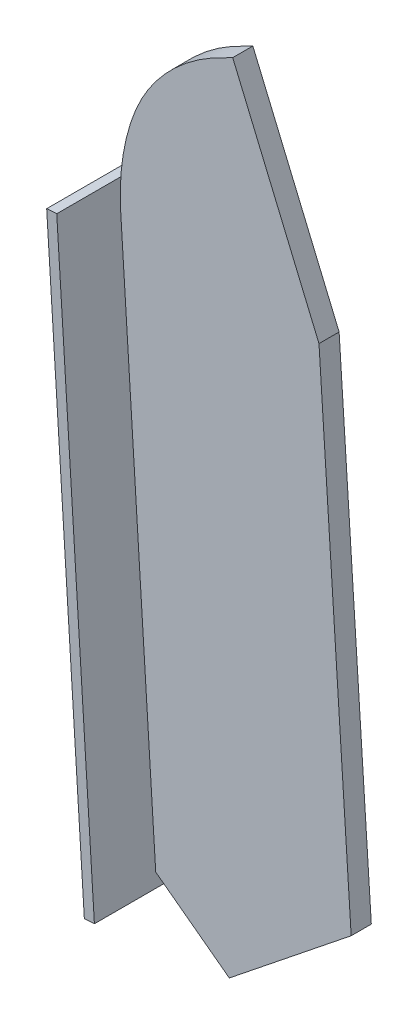
ISO-10303-21;
HEADER;
FILE_DESCRIPTION(('STEP AP214'),'2;1');
FILE_NAME('part.step','',(''),(''),'','','');
FILE_SCHEMA(('AUTOMOTIVE_DESIGN { 1 0 10303 214 1 1 1 1 }'));
ENDSEC;
DATA;
#1=APPLICATION_CONTEXT('core data for automotive mechanical design processes');
#2=APPLICATION_PROTOCOL_DEFINITION('international standard','automotive_design',2000,#1);
#3=PRODUCT_CONTEXT('',#1,'mechanical');
#4=PRODUCT('Part','Part','',(#3));
#5=PRODUCT_RELATED_PRODUCT_CATEGORY('part','',(#4));
#6=PRODUCT_DEFINITION_FORMATION('','',#4);
#7=PRODUCT_DEFINITION_CONTEXT('part definition',#1,'design');
#8=PRODUCT_DEFINITION('design','',#6,#7);
#9=PRODUCT_DEFINITION_SHAPE('','',#8);
#10=(LENGTH_UNIT() NAMED_UNIT(*) SI_UNIT(.MILLI.,.METRE.));
#11=(NAMED_UNIT(*) PLANE_ANGLE_UNIT() SI_UNIT($,.RADIAN.));
#12=(NAMED_UNIT(*) SI_UNIT($,.STERADIAN.) SOLID_ANGLE_UNIT());
#13=UNCERTAINTY_MEASURE_WITH_UNIT(LENGTH_MEASURE(1.E-05),#10,'distance_accuracy_value','');
#14=(GEOMETRIC_REPRESENTATION_CONTEXT(3) GLOBAL_UNCERTAINTY_ASSIGNED_CONTEXT((#13)) GLOBAL_UNIT_ASSIGNED_CONTEXT((#10,
#11,#12)) REPRESENTATION_CONTEXT('',''));
#15=CARTESIAN_POINT('',(0.,0.,0.));
#16=DIRECTION('',(0.,0.,1.));
#17=DIRECTION('',(1.,0.,0.));
#18=AXIS2_PLACEMENT_3D('',#15,#16,#17);
#19=CARTESIAN_POINT('',(-5.76768563353413,19.4994353421923,0.));
#20=DIRECTION('',(0.,0.,-1.));
#21=DIRECTION('',(-1.,0.,0.));
#22=AXIS2_PLACEMENT_3D('',#19,#20,#21);
#23=PLANE('',#22);
#24=DIRECTION('',(0.0630690403554269,-0.998009166365042,0.));
#25=VECTOR('',#24,1.);
#26=CARTESIAN_POINT('',(-7.28962168100287,19.4032568207607,0.));
#27=LINE('',#26,#25);
#28=CARTESIAN_POINT('',(-6.85277047189869,12.4904909285472,0.));
#29=VERTEX_POINT('',#28);
#30=CARTESIAN_POINT('',(-4.76666804704125,-20.5201483685025,0.));
#31=VERTEX_POINT('',#30);
#32=EDGE_CURVE('E234',#29,#31,#27,.T.);
#33=ORIENTED_EDGE('',*,*,#32,.F.);
#34=CARTESIAN_POINT('',(-0.181718188574369,23.7999261697487,0.));
#35=CARTESIAN_POINT('',(-0.70701341469865,23.5395380632294,0.));
#36=CARTESIAN_POINT('',(-1.23207783293486,23.2788070843344,0.));
#37=CARTESIAN_POINT('',(-2.23051080300372,22.6805492913545,0.));
#38=CARTESIAN_POINT('',(-2.70217201621648,22.3404861720603,0.));
#39=CARTESIAN_POINT('',(-3.59629517879887,21.5872728798945,0.));
#40=CARTESIAN_POINT('',(-4.02213355400517,21.1707525213189,0.));
#41=CARTESIAN_POINT('',(-4.78527457469842,20.2822620551444,0.));
#42=CARTESIAN_POINT('',(-5.12606160934101,19.8085724179294,0.));
#43=CARTESIAN_POINT('',(-5.56732173647134,19.0475575846983,0.));
#44=CARTESIAN_POINT('',(-5.70332933890473,18.7843151964143,0.));
#45=CARTESIAN_POINT('',(-5.95018246511931,18.2473971483734,0.));
#46=CARTESIAN_POINT('',(-6.0605755664184,17.9749523186406,0.));
#47=CARTESIAN_POINT('',(-6.35630443044148,17.1467766141278,0.));
#48=CARTESIAN_POINT('',(-6.50722921559899,16.5805224054116,0.));
#49=CARTESIAN_POINT('',(-6.73943545605117,15.4267161328061,0.));
#50=CARTESIAN_POINT('',(-6.81702667694273,14.8395680904238,0.));
#51=CARTESIAN_POINT('',(-6.87668510198232,13.6670249779812,0.));
#52=CARTESIAN_POINT('',(-6.86465760643239,13.0787546018732,0.));
#53=CARTESIAN_POINT('',(-6.85277047189869,12.4904909285471,0.));
#54=B_SPLINE_CURVE_WITH_KNOTS('',3,(#34,#35,#36,#37,#38,#39,#40,#41,#42,#43,#44,#45,#46,#47,#48,
#49,#50,#51,#52,#53),.UNSPECIFIED.,.F.,.F.,(4,2,2,2,2,2,2,2,2,4),(0.,0.125,0.25,
0.375000000000001,0.500000000000001,0.562500000000001,0.625000000000001,0.750000000000001,0.875,
1.),.UNSPECIFIED.);
#55=CARTESIAN_POINT('',(-0.181718188574369,23.7999261697487,0.));
#56=VERTEX_POINT('',#55);
#57=EDGE_CURVE('E116',#56,#29,#54,.T.);
#58=ORIENTED_EDGE('',*,*,#57,.F.);
#59=DIRECTION('',(-0.946291022800123,-0.323316099456704,0.));
#60=VECTOR('',#59,1.);
#61=CARTESIAN_POINT('',(-6.49950601762717,21.641348661489,0.));
#62=LINE('',#61,#60);
#63=CARTESIAN_POINT('',(-0.180003158251313,23.8005121384424,0.));
#64=VERTEX_POINT('',#63);
#65=EDGE_CURVE('E283',#64,#56,#62,.T.);
#66=ORIENTED_EDGE('',*,*,#65,.F.);
#67=DIRECTION('',(-0.388700505404293,0.92136416095833,0.));
#68=VECTOR('',#67,1.);
#69=CARTESIAN_POINT('',(0.51612952142517,22.1504198606907,0.));
#70=LINE('',#69,#68);
#71=CARTESIAN_POINT('',(4.96086831706904,11.6147427154608,0.));
#72=VERTEX_POINT('',#71);
#73=EDGE_CURVE('E280',#72,#64,#70,.T.);
#74=ORIENTED_EDGE('',*,*,#73,.F.);
#75=DIRECTION('',(-0.0646917913541603,0.997905292165238,0.));
#76=VECTOR('',#75,1.);
#77=CARTESIAN_POINT('',(4.4069625873647,20.1590332268574,0.));
#78=LINE('',#77,#76);
#79=CARTESIAN_POINT('',(6.87971706119031,-17.9845198268355,0.));
#80=VERTEX_POINT('',#79);
#81=EDGE_CURVE('E275',#80,#72,#78,.T.);
#82=ORIENTED_EDGE('',*,*,#81,.F.);
#83=DIRECTION('',(0.78086880944303,0.624695047554424,0.));
#84=VECTOR('',#83,1.);
#85=CARTESIAN_POINT('',(17.4527423297865,-9.52609961195851,0.));
#86=LINE('',#85,#84);
#87=CARTESIAN_POINT('',(-0.382255805973252,-23.7940981205663,0.));
#88=VERTEX_POINT('',#87);
#89=EDGE_CURVE('E273',#88,#80,#86,.T.);
#90=ORIENTED_EDGE('',*,*,#89,.F.);
#91=DIRECTION('',(0.801257856401329,-0.59831918534771,0.));
#92=VECTOR('',#91,1.);
#93=CARTESIAN_POINT('',(-24.595042006792,-5.71380798807742,0.));
#94=LINE('',#93,#92);
#95=EDGE_CURVE('E271',#31,#88,#94,.T.);
#96=ORIENTED_EDGE('',*,*,#95,.F.);
#97=EDGE_LOOP('',(#33,#58,#66,#74,#82,#90,#96));
#98=FACE_BOUND('',#97,.T.);
#99=ADVANCED_FACE('F92',(#98),#23,.T.);
#100=DIRECTION('',(0.,0.,1.));
#101=VECTOR('',#100,1.);
#102=SURFACE_OF_LINEAR_EXTRUSION('',#54,#101);
#103=CARTESIAN_POINT('',(-0.181718188574369,23.7999261697487,1.2));
#104=CARTESIAN_POINT('',(-0.70701341469865,23.5395380632294,1.2));
#105=CARTESIAN_POINT('',(-1.23207783293486,23.2788070843344,1.2));
#106=CARTESIAN_POINT('',(-2.23051080300372,22.6805492913545,1.2));
#107=CARTESIAN_POINT('',(-2.70217201621648,22.3404861720603,1.2));
#108=CARTESIAN_POINT('',(-3.59629517879887,21.5872728798945,1.2));
#109=CARTESIAN_POINT('',(-4.02213355400517,21.1707525213189,1.2));
#110=CARTESIAN_POINT('',(-4.78527457469842,20.2822620551444,1.2));
#111=CARTESIAN_POINT('',(-5.12606160934101,19.8085724179294,1.2));
#112=CARTESIAN_POINT('',(-5.56732173647134,19.0475575846983,1.2));
#113=CARTESIAN_POINT('',(-5.70332933890473,18.7843151964143,1.2));
#114=CARTESIAN_POINT('',(-5.95018246511931,18.2473971483734,1.2));
#115=CARTESIAN_POINT('',(-6.0605755664184,17.9749523186406,1.2));
#116=CARTESIAN_POINT('',(-6.35630443044148,17.1467766141278,1.2));
#117=CARTESIAN_POINT('',(-6.50722921559899,16.5805224054116,1.2));
#118=CARTESIAN_POINT('',(-6.73943545605117,15.4267161328061,1.2));
#119=CARTESIAN_POINT('',(-6.81702667694273,14.8395680904238,1.2));
#120=CARTESIAN_POINT('',(-6.87668510198232,13.6670249779812,1.2));
#121=CARTESIAN_POINT('',(-6.86465760643239,13.0787546018732,1.2));
#122=CARTESIAN_POINT('',(-6.85277047189869,12.4904909285471,1.2));
#123=B_SPLINE_CURVE_WITH_KNOTS('',3,(#103,#104,#105,#106,#107,#108,#109,#110,#111,#112,#113,
#114,#115,#116,#117,#118,#119,#120,#121,#122),.UNSPECIFIED.,.F.,.F.,(4,2,2,2,2,2,2,2,2,4),(0.,
0.125,0.25,0.375000000000001,0.500000000000001,0.562500000000001,0.625000000000001,
0.750000000000001,0.875,1.),.UNSPECIFIED.);
#124=CARTESIAN_POINT('',(-0.181718188574369,23.7999261697487,1.2));
#125=VERTEX_POINT('',#124);
#126=CARTESIAN_POINT('',(-6.85277047189869,12.4904909285472,1.2));
#127=VERTEX_POINT('',#126);
#128=EDGE_CURVE('E227',#125,#127,#123,.T.);
#129=ORIENTED_EDGE('',*,*,#128,.F.);
#130=DIRECTION('',(0.,0.,1.));
#131=VECTOR('',#130,1.);
#132=CARTESIAN_POINT('',(-0.181718188574369,23.7999261697487,0.));
#133=LINE('',#132,#131);
#134=EDGE_CURVE('E12',#56,#125,#133,.T.);
#135=ORIENTED_EDGE('',*,*,#134,.F.);
#136=ORIENTED_EDGE('',*,*,#57,.T.);
#137=DIRECTION('',(0.,0.,1.));
#138=VECTOR('',#137,1.);
#139=CARTESIAN_POINT('',(-6.85277047189869,12.4904909285472,0.));
#140=LINE('',#139,#138);
#141=EDGE_CURVE('E95',#29,#127,#140,.T.);
#142=ORIENTED_EDGE('',*,*,#141,.T.);
#143=EDGE_LOOP('',(#129,#135,#136,#142));
#144=FACE_BOUND('',#143,.T.);
#145=ADVANCED_FACE('F241',(#144),#102,.T.);
#146=CARTESIAN_POINT('',(-6.49950601762717,21.641348661489,0.));
#147=DIRECTION('',(-0.323316099456704,0.946291022800123,0.));
#148=DIRECTION('',(-0.946291022800123,-0.323316099456704,0.));
#149=AXIS2_PLACEMENT_3D('',#146,#147,#148);
#150=PLANE('',#149);
#151=DIRECTION('',(-0.946291022800123,-0.323316099456704,0.));
#152=VECTOR('',#151,1.);
#153=CARTESIAN_POINT('',(-6.49950601762717,21.641348661489,1.2));
#154=LINE('',#153,#152);
#155=CARTESIAN_POINT('',(-0.180003158251313,23.8005121384424,1.2));
#156=VERTEX_POINT('',#155);
#157=EDGE_CURVE('E235',#156,#125,#154,.T.);
#158=ORIENTED_EDGE('',*,*,#157,.F.);
#159=DIRECTION('',(0.,0.,1.));
#160=VECTOR('',#159,1.);
#161=CARTESIAN_POINT('',(-0.180003158251313,23.8005121384424,0.));
#162=LINE('',#161,#160);
#163=EDGE_CURVE('E100',#64,#156,#162,.T.);
#164=ORIENTED_EDGE('',*,*,#163,.F.);
#165=ORIENTED_EDGE('',*,*,#65,.T.);
#166=ORIENTED_EDGE('',*,*,#134,.T.);
#167=EDGE_LOOP('',(#158,#164,#165,#166));
#168=FACE_BOUND('',#167,.T.);
#169=ADVANCED_FACE('F244',(#168),#150,.T.);
#170=CARTESIAN_POINT('',(0.51612952142517,22.1504198606907,0.));
#171=DIRECTION('',(0.92136416095833,0.388700505404293,0.));
#172=DIRECTION('',(-0.388700505404293,0.92136416095833,0.));
#173=AXIS2_PLACEMENT_3D('',#170,#171,#172);
#174=PLANE('',#173);
#175=DIRECTION('',(-0.388700505404293,0.92136416095833,0.));
#176=VECTOR('',#175,1.);
#177=CARTESIAN_POINT('',(0.51612952142517,22.1504198606907,1.2));
#178=LINE('',#177,#176);
#179=CARTESIAN_POINT('',(4.96086831706904,11.6147427154608,1.2));
#180=VERTEX_POINT('',#179);
#181=EDGE_CURVE('E302',#180,#156,#178,.T.);
#182=ORIENTED_EDGE('',*,*,#181,.F.);
#183=DIRECTION('',(0.,0.,1.));
#184=VECTOR('',#183,1.);
#185=CARTESIAN_POINT('',(4.96086831706904,11.6147427154608,0.));
#186=LINE('',#185,#184);
#187=EDGE_CURVE('E308',#72,#180,#186,.T.);
#188=ORIENTED_EDGE('',*,*,#187,.F.);
#189=ORIENTED_EDGE('',*,*,#73,.T.);
#190=ORIENTED_EDGE('',*,*,#163,.T.);
#191=EDGE_LOOP('',(#182,#188,#189,#190));
#192=FACE_BOUND('',#191,.T.);
#193=ADVANCED_FACE('F322',(#192),#174,.T.);
#194=CARTESIAN_POINT('',(4.4069625873647,20.1590332268574,0.));
#195=DIRECTION('',(0.997905292165238,0.0646917913541603,0.));
#196=DIRECTION('',(-0.0646917913541603,0.997905292165238,0.));
#197=AXIS2_PLACEMENT_3D('',#194,#195,#196);
#198=PLANE('',#197);
#199=DIRECTION('',(-0.0646917913541603,0.997905292165238,0.));
#200=VECTOR('',#199,1.);
#201=CARTESIAN_POINT('',(4.4069625873647,20.1590332268574,1.2));
#202=LINE('',#201,#200);
#203=CARTESIAN_POINT('',(6.87971706119031,-17.9845198268355,1.2));
#204=VERTEX_POINT('',#203);
#205=EDGE_CURVE('E299',#204,#180,#202,.T.);
#206=ORIENTED_EDGE('',*,*,#205,.F.);
#207=DIRECTION('',(0.,0.,1.));
#208=VECTOR('',#207,1.);
#209=CARTESIAN_POINT('',(6.87971706119031,-17.9845198268355,0.));
#210=LINE('',#209,#208);
#211=EDGE_CURVE('E310',#80,#204,#210,.T.);
#212=ORIENTED_EDGE('',*,*,#211,.F.);
#213=ORIENTED_EDGE('',*,*,#81,.T.);
#214=ORIENTED_EDGE('',*,*,#187,.T.);
#215=EDGE_LOOP('',(#206,#212,#213,#214));
#216=FACE_BOUND('',#215,.T.);
#217=ADVANCED_FACE('F325',(#216),#198,.T.);
#218=CARTESIAN_POINT('',(17.4527423297865,-9.52609961195851,0.));
#219=DIRECTION('',(0.624695047554424,-0.78086880944303,0.));
#220=DIRECTION('',(0.78086880944303,0.624695047554424,0.));
#221=AXIS2_PLACEMENT_3D('',#218,#219,#220);
#222=PLANE('',#221);
#223=DIRECTION('',(0.78086880944303,0.624695047554424,0.));
#224=VECTOR('',#223,1.);
#225=CARTESIAN_POINT('',(17.4527423297865,-9.52609961195851,1.2));
#226=LINE('',#225,#224);
#227=CARTESIAN_POINT('',(-0.382255805973252,-23.7940981205663,1.2));
#228=VERTEX_POINT('',#227);
#229=EDGE_CURVE('E296',#228,#204,#226,.T.);
#230=ORIENTED_EDGE('',*,*,#229,.F.);
#231=DIRECTION('',(0.,0.,1.));
#232=VECTOR('',#231,1.);
#233=CARTESIAN_POINT('',(-0.382255805973252,-23.7940981205663,0.));
#234=LINE('',#233,#232);
#235=EDGE_CURVE('E312',#88,#228,#234,.T.);
#236=ORIENTED_EDGE('',*,*,#235,.F.);
#237=ORIENTED_EDGE('',*,*,#89,.T.);
#238=ORIENTED_EDGE('',*,*,#211,.T.);
#239=EDGE_LOOP('',(#230,#236,#237,#238));
#240=FACE_BOUND('',#239,.T.);
#241=ADVANCED_FACE('F328',(#240),#222,.T.);
#242=CARTESIAN_POINT('',(-24.595042006792,-5.71380798807742,0.));
#243=DIRECTION('',(-0.59831918534771,-0.801257856401329,0.));
#244=DIRECTION('',(0.801257856401329,-0.59831918534771,0.));
#245=AXIS2_PLACEMENT_3D('',#242,#243,#244);
#246=PLANE('',#245);
#247=DIRECTION('',(0.801257856401329,-0.59831918534771,0.));
#248=VECTOR('',#247,1.);
#249=CARTESIAN_POINT('',(-24.595042006792,-5.71380798807742,1.2));
#250=LINE('',#249,#248);
#251=CARTESIAN_POINT('',(-4.76666804704125,-20.5201483685025,1.2));
#252=VERTEX_POINT('',#251);
#253=EDGE_CURVE('E108',#252,#228,#250,.T.);
#254=ORIENTED_EDGE('',*,*,#253,.F.);
#255=DIRECTION('',(0.,0.,1.));
#256=VECTOR('',#255,1.);
#257=CARTESIAN_POINT('',(-4.76666804704125,-20.5201483685025,0.));
#258=LINE('',#257,#256);
#259=EDGE_CURVE('E313',#31,#252,#258,.T.);
#260=ORIENTED_EDGE('',*,*,#259,.F.);
#261=ORIENTED_EDGE('',*,*,#95,.T.);
#262=ORIENTED_EDGE('',*,*,#235,.T.);
#263=EDGE_LOOP('',(#254,#260,#261,#262));
#264=FACE_BOUND('',#263,.T.);
#265=ADVANCED_FACE('F258',(#264),#246,.T.);
#266=CARTESIAN_POINT('',(-7.28962168100287,19.4032568207607,0.));
#267=DIRECTION('',(-0.998009166365042,-0.0630690403554269,0.));
#268=DIRECTION('',(0.0630690403554269,-0.998009166365042,0.));
#269=AXIS2_PLACEMENT_3D('',#266,#267,#268);
#270=PLANE('',#269);
#271=CARTESIAN_POINT('',(-6.81010495455708,11.8153486217248,0.599999999999891));
#272=DIRECTION('',(-0.998009166365042,-0.0630690403554269,0.));
#273=DIRECTION('',(0.0630690403554269,-0.998009166365042,0.));
#274=AXIS2_PLACEMENT_3D('',#271,#272,#273);
#275=CIRCLE('',#274,0.300000000000001);
#276=CARTESIAN_POINT('',(-6.79118424245045,11.5159458718153,0.599999999999891));
#277=VERTEX_POINT('',#276);
#278=EDGE_CURVE('E203',#277,#277,#275,.T.);
#279=ORIENTED_EDGE('',*,*,#278,.F.);
#280=EDGE_LOOP('',(#279));
#281=FACE_BOUND('',#280,.T.);
#282=CARTESIAN_POINT('',(-6.14157312678955,1.23645145825541,0.599999999999927));
#283=DIRECTION('',(-0.998009166365042,-0.0630690403554269,0.));
#284=DIRECTION('',(0.0630690403554269,-0.998009166365042,0.));
#285=AXIS2_PLACEMENT_3D('',#282,#283,#284);
#286=CIRCLE('',#285,0.300000000000001);
#287=CARTESIAN_POINT('',(-6.12265241468292,0.937048708345893,0.599999999999927));
#288=VERTEX_POINT('',#287);
#289=EDGE_CURVE('E212',#288,#288,#286,.T.);
#290=ORIENTED_EDGE('',*,*,#289,.F.);
#291=EDGE_LOOP('',(#290));
#292=FACE_BOUND('',#291,.T.);
#293=CARTESIAN_POINT('',(-5.47304129902203,-9.34244570521404,0.599999999999964));
#294=DIRECTION('',(-0.998009166365042,-0.0630690403554269,0.));
#295=DIRECTION('',(0.0630690403554269,-0.998009166365042,0.));
#296=AXIS2_PLACEMENT_3D('',#293,#294,#295);
#297=CIRCLE('',#296,0.300000000000001);
#298=CARTESIAN_POINT('',(-5.4541205869154,-9.64184845512355,0.599999999999964));
#299=VERTEX_POINT('',#298);
#300=EDGE_CURVE('E218',#299,#299,#297,.T.);
#301=ORIENTED_EDGE('',*,*,#300,.F.);
#302=EDGE_LOOP('',(#301));
#303=FACE_BOUND('',#302,.T.);
#304=CARTESIAN_POINT('',(-4.8045094712545,-19.9213428686835,0.6));
#305=DIRECTION('',(-0.998009166365042,-0.0630690403554269,0.));
#306=DIRECTION('',(0.0630690403554269,-0.998009166365042,0.));
#307=AXIS2_PLACEMENT_3D('',#304,#305,#306);
#308=CIRCLE('',#307,0.300000000000001);
#309=CARTESIAN_POINT('',(-4.78558875914787,-20.220745618593,0.6));
#310=VERTEX_POINT('',#309);
#311=EDGE_CURVE('E221',#310,#310,#308,.T.);
#312=ORIENTED_EDGE('',*,*,#311,.F.);
#313=EDGE_LOOP('',(#312));
#314=FACE_BOUND('',#313,.T.);
#315=DIRECTION('',(0.0630690403554269,-0.998009166365042,0.));
#316=VECTOR('',#315,1.);
#317=CARTESIAN_POINT('',(-7.28962168100287,19.4032568207607,1.2));
#318=LINE('',#317,#316);
#319=EDGE_CURVE('E289',#127,#252,#318,.T.);
#320=ORIENTED_EDGE('',*,*,#319,.F.);
#321=ORIENTED_EDGE('',*,*,#141,.F.);
#322=ORIENTED_EDGE('',*,*,#32,.T.);
#323=ORIENTED_EDGE('',*,*,#259,.T.);
#324=EDGE_LOOP('',(#320,#321,#322,#323));
#325=FACE_BOUND('',#324,.T.);
#326=ADVANCED_FACE('F245',(#281,#292,#303,#314,#325),#270,.T.);
#327=CARTESIAN_POINT('',(-5.76768563353413,19.4994353421923,1.2));
#328=DIRECTION('',(0.,0.,-1.));
#329=DIRECTION('',(-1.,0.,0.));
#330=AXIS2_PLACEMENT_3D('',#327,#328,#329);
#331=PLANE('',#330);
#332=ORIENTED_EDGE('',*,*,#128,.T.);
#333=ORIENTED_EDGE('',*,*,#319,.T.);
#334=ORIENTED_EDGE('',*,*,#253,.T.);
#335=ORIENTED_EDGE('',*,*,#229,.T.);
#336=ORIENTED_EDGE('',*,*,#205,.T.);
#337=ORIENTED_EDGE('',*,*,#181,.T.);
#338=ORIENTED_EDGE('',*,*,#157,.T.);
#339=EDGE_LOOP('',(#332,#333,#334,#335,#336,#337,#338));
#340=FACE_BOUND('',#339,.T.);
#341=ADVANCED_FACE('F247',(#340),#331,.F.);
#342=CARTESIAN_POINT('',(-5.10391222116401,-19.9402635807901,0.6));
#343=DIRECTION('',(0.998009166365042,0.0630690403554269,0.));
#344=DIRECTION('',(-0.0630690403554269,0.998009166365042,0.));
#345=AXIS2_PLACEMENT_3D('',#342,#343,#344);
#346=CYLINDRICAL_SURFACE('',#345,0.300000000000001);
#347=CARTESIAN_POINT('',(-5.10391222116401,-19.9402635807901,0.6));
#348=DIRECTION('',(-0.998009166365042,-0.0630690403554269,0.));
#349=DIRECTION('',(0.0630690403554269,-0.998009166365042,0.));
#350=AXIS2_PLACEMENT_3D('',#347,#348,#349);
#351=CIRCLE('',#350,0.300000000000001);
#352=CARTESIAN_POINT('',(-5.08499150905739,-20.2396663306996,0.6));
#353=VERTEX_POINT('',#352);
#354=EDGE_CURVE('E224',#353,#353,#351,.T.);
#355=ORIENTED_EDGE('',*,*,#354,.F.);
#356=EDGE_LOOP('',(#355));
#357=FACE_BOUND('',#356,.T.);
#358=ORIENTED_EDGE('',*,*,#311,.T.);
#359=EDGE_LOOP('',(#358));
#360=FACE_BOUND('',#359,.T.);
#361=ADVANCED_FACE('F249',(#357,#360),#346,.T.);
#362=CARTESIAN_POINT('',(-5.77244404893154,-9.36136641732067,0.599999999999964));
#363=DIRECTION('',(0.998009166365042,0.0630690403554269,0.));
#364=DIRECTION('',(-0.0630690403554269,0.998009166365042,0.));
#365=AXIS2_PLACEMENT_3D('',#362,#363,#364);
#366=CYLINDRICAL_SURFACE('',#365,0.300000000000001);
#367=CARTESIAN_POINT('',(-5.77244404893154,-9.36136641732067,0.599999999999964));
#368=DIRECTION('',(-0.998009166365042,-0.0630690403554269,0.));
#369=DIRECTION('',(0.0630690403554269,-0.998009166365042,0.));
#370=AXIS2_PLACEMENT_3D('',#367,#368,#369);
#371=CIRCLE('',#370,0.300000000000001);
#372=CARTESIAN_POINT('',(-5.75352333682491,-9.66076916723018,0.599999999999964));
#373=VERTEX_POINT('',#372);
#374=EDGE_CURVE('E215',#373,#373,#371,.T.);
#375=ORIENTED_EDGE('',*,*,#374,.F.);
#376=EDGE_LOOP('',(#375));
#377=FACE_BOUND('',#376,.T.);
#378=ORIENTED_EDGE('',*,*,#300,.T.);
#379=EDGE_LOOP('',(#378));
#380=FACE_BOUND('',#379,.T.);
#381=ADVANCED_FACE('F255',(#377,#380),#366,.T.);
#382=CARTESIAN_POINT('',(-6.44097587669907,1.21753074614878,0.599999999999927));
#383=DIRECTION('',(0.998009166365042,0.0630690403554269,0.));
#384=DIRECTION('',(-0.0630690403554269,0.998009166365042,0.));
#385=AXIS2_PLACEMENT_3D('',#382,#383,#384);
#386=CYLINDRICAL_SURFACE('',#385,0.300000000000001);
#387=CARTESIAN_POINT('',(-6.44097587669907,1.21753074614878,0.599999999999927));
#388=DIRECTION('',(-0.998009166365042,-0.0630690403554269,0.));
#389=DIRECTION('',(0.0630690403554269,-0.998009166365042,0.));
#390=AXIS2_PLACEMENT_3D('',#387,#388,#389);
#391=CIRCLE('',#390,0.300000000000001);
#392=CARTESIAN_POINT('',(-6.42205516459244,0.918127996239265,0.599999999999927));
#393=VERTEX_POINT('',#392);
#394=EDGE_CURVE('E210',#393,#393,#391,.T.);
#395=ORIENTED_EDGE('',*,*,#394,.F.);
#396=EDGE_LOOP('',(#395));
#397=FACE_BOUND('',#396,.T.);
#398=ORIENTED_EDGE('',*,*,#289,.T.);
#399=EDGE_LOOP('',(#398));
#400=FACE_BOUND('',#399,.T.);
#401=ADVANCED_FACE('F343',(#397,#400),#386,.T.);
#402=CARTESIAN_POINT('',(-7.10950770446659,11.7964279096182,0.599999999999891));
#403=DIRECTION('',(0.998009166365042,0.0630690403554269,0.));
#404=DIRECTION('',(-0.0630690403554269,0.998009166365042,0.));
#405=AXIS2_PLACEMENT_3D('',#402,#403,#404);
#406=CYLINDRICAL_SURFACE('',#405,0.300000000000001);
#407=CARTESIAN_POINT('',(-7.10950770446659,11.7964279096182,0.599999999999891));
#408=DIRECTION('',(-0.998009166365042,-0.0630690403554269,0.));
#409=DIRECTION('',(0.0630690403554269,-0.998009166365042,0.));
#410=AXIS2_PLACEMENT_3D('',#407,#408,#409);
#411=CIRCLE('',#410,0.300000000000001);
#412=CARTESIAN_POINT('',(-7.09058699235996,11.4970251597087,0.599999999999891));
#413=VERTEX_POINT('',#412);
#414=EDGE_CURVE('E200',#413,#413,#411,.T.);
#415=ORIENTED_EDGE('',*,*,#414,.F.);
#416=EDGE_LOOP('',(#415));
#417=FACE_BOUND('',#416,.T.);
#418=ORIENTED_EDGE('',*,*,#278,.T.);
#419=EDGE_LOOP('',(#418));
#420=FACE_BOUND('',#419,.T.);
#421=ADVANCED_FACE('F347',(#417,#420),#406,.T.);
#422=CARTESIAN_POINT('',(-7.84277357193982,13.8862973031923,-3.95309351771247));
#423=DIRECTION('',(0.,0.,1.));
#424=DIRECTION('',(1.,0.,0.));
#425=AXIS2_PLACEMENT_3D('',#422,#423,#424);
#426=PLANE('',#425);
#427=DIRECTION('',(0.0630690403554269,-0.998009166365042,0.));
#428=VECTOR('',#427,1.);
#429=CARTESIAN_POINT('',(-7.2439680721208,13.9241387274056,-3.95309351771247));
#430=LINE('',#429,#428);
#431=CARTESIAN_POINT('',(-7.2439680721208,13.9241387274056,-3.95309351771247));
#432=VERTEX_POINT('',#431);
#433=CARTESIAN_POINT('',(-4.99934002208433,-21.5950218051158,-3.95309351771247));
#434=VERTEX_POINT('',#433);
#435=EDGE_CURVE('E199',#432,#434,#430,.T.);
#436=ORIENTED_EDGE('',*,*,#435,.T.);
#437=DIRECTION('',(0.998009166365042,0.0630690403554269,0.));
#438=VECTOR('',#437,1.);
#439=CARTESIAN_POINT('',(-5.59814552190336,-21.6328632293291,-3.95309351771247));
#440=LINE('',#439,#438);
#441=CARTESIAN_POINT('',(-5.59814552190336,-21.6328632293291,-3.95309351771247));
#442=VERTEX_POINT('',#441);
#443=EDGE_CURVE('E179',#442,#434,#440,.T.);
#444=ORIENTED_EDGE('',*,*,#443,.F.);
#445=DIRECTION('',(0.0630690403554269,-0.998009166365042,0.));
#446=VECTOR('',#445,1.);
#447=CARTESIAN_POINT('',(-7.84277357193982,13.8862973031923,-3.95309351771247));
#448=LINE('',#447,#446);
#449=CARTESIAN_POINT('',(-7.84277357193982,13.8862973031923,-3.95309351771247));
#450=VERTEX_POINT('',#449);
#451=EDGE_CURVE('E186',#450,#442,#448,.T.);
#452=ORIENTED_EDGE('',*,*,#451,.F.);
#453=DIRECTION('',(0.998009166365042,0.0630690403554269,0.));
#454=VECTOR('',#453,1.);
#455=CARTESIAN_POINT('',(-7.84277357193982,13.8862973031923,-3.95309351771247));
#456=LINE('',#455,#454);
#457=EDGE_CURVE('E534',#450,#432,#456,.T.);
#458=ORIENTED_EDGE('',*,*,#457,.T.);
#459=EDGE_LOOP('',(#436,#444,#452,#458));
#460=FACE_BOUND('',#459,.T.);
#461=ADVANCED_FACE('F197',(#460),#426,.F.);
#462=CARTESIAN_POINT('',(-5.59814552190336,-21.6328632293291,-3.95309351771247));
#463=DIRECTION('',(-0.0630690403554269,0.998009166365042,0.));
#464=DIRECTION('',(-0.998009166365042,-0.0630690403554269,0.));
#465=AXIS2_PLACEMENT_3D('',#462,#463,#464);
#466=PLANE('',#465);
#467=DIRECTION('',(0.,0.,1.));
#468=VECTOR('',#467,1.);
#469=CARTESIAN_POINT('',(-4.99934002208433,-21.5950218051158,-3.95309351771247));
#470=LINE('',#469,#468);
#471=CARTESIAN_POINT('',(-4.99934002208433,-21.5950218051158,4.62189927397935));
#472=VERTEX_POINT('',#471);
#473=EDGE_CURVE('E525',#434,#472,#470,.T.);
#474=ORIENTED_EDGE('',*,*,#473,.T.);
#475=DIRECTION('',(0.998009166365042,0.0630690403554269,0.));
#476=VECTOR('',#475,1.);
#477=CARTESIAN_POINT('',(-5.59814552190336,-21.6328632293291,4.62189927397935));
#478=LINE('',#477,#476);
#479=CARTESIAN_POINT('',(-5.59814552190336,-21.6328632293291,4.62189927397935));
#480=VERTEX_POINT('',#479);
#481=EDGE_CURVE('E182',#480,#472,#478,.T.);
#482=ORIENTED_EDGE('',*,*,#481,.F.);
#483=DIRECTION('',(0.,0.,1.));
#484=VECTOR('',#483,1.);
#485=CARTESIAN_POINT('',(-5.59814552190336,-21.6328632293291,-3.95309351771247));
#486=LINE('',#485,#484);
#487=EDGE_CURVE('E175',#442,#480,#486,.T.);
#488=ORIENTED_EDGE('',*,*,#487,.F.);
#489=ORIENTED_EDGE('',*,*,#443,.T.);
#490=EDGE_LOOP('',(#474,#482,#488,#489));
#491=FACE_BOUND('',#490,.T.);
#492=ADVANCED_FACE('F177',(#491),#466,.F.);
#493=CARTESIAN_POINT('',(-7.84277357193982,13.8862973031923,4.62189927397935));
#494=DIRECTION('',(0.,0.,-1.));
#495=DIRECTION('',(-1.,0.,0.));
#496=AXIS2_PLACEMENT_3D('',#493,#494,#495);
#497=PLANE('',#496);
#498=DIRECTION('',(-0.0630690403554269,0.998009166365042,0.));
#499=VECTOR('',#498,1.);
#500=CARTESIAN_POINT('',(-7.2439680721208,13.9241387274056,4.62189927397935));
#501=LINE('',#500,#499);
#502=CARTESIAN_POINT('',(-7.2439680721208,13.9241387274056,4.62189927397935));
#503=VERTEX_POINT('',#502);
#504=EDGE_CURVE('E527',#472,#503,#501,.T.);
#505=ORIENTED_EDGE('',*,*,#504,.T.);
#506=DIRECTION('',(0.998009166365042,0.0630690403554269,0.));
#507=VECTOR('',#506,1.);
#508=CARTESIAN_POINT('',(-7.84277357193982,13.8862973031923,4.62189927397935));
#509=LINE('',#508,#507);
#510=CARTESIAN_POINT('',(-7.84277357193982,13.8862973031923,4.62189927397935));
#511=VERTEX_POINT('',#510);
#512=EDGE_CURVE('E205',#511,#503,#509,.T.);
#513=ORIENTED_EDGE('',*,*,#512,.F.);
#514=DIRECTION('',(-0.0630690403554269,0.998009166365042,0.));
#515=VECTOR('',#514,1.);
#516=CARTESIAN_POINT('',(-7.84277357193982,13.8862973031923,4.62189927397935));
#517=LINE('',#516,#515);
#518=EDGE_CURVE('E185',#480,#511,#517,.T.);
#519=ORIENTED_EDGE('',*,*,#518,.F.);
#520=ORIENTED_EDGE('',*,*,#481,.T.);
#521=EDGE_LOOP('',(#505,#513,#519,#520));
#522=FACE_BOUND('',#521,.T.);
#523=ADVANCED_FACE('F356',(#522),#497,.F.);
#524=CARTESIAN_POINT('',(-7.84277357193982,13.8862973031923,-3.95309351771247));
#525=DIRECTION('',(0.0630690403554269,-0.998009166365042,0.));
#526=DIRECTION('',(0.998009166365042,0.0630690403554269,0.));
#527=AXIS2_PLACEMENT_3D('',#524,#525,#526);
#528=PLANE('',#527);
#529=DIRECTION('',(0.,0.,-1.));
#530=VECTOR('',#529,1.);
#531=CARTESIAN_POINT('',(-7.2439680721208,13.9241387274056,-3.95309351771247));
#532=LINE('',#531,#530);
#533=EDGE_CURVE('E195',#503,#432,#532,.T.);
#534=ORIENTED_EDGE('',*,*,#533,.T.);
#535=ORIENTED_EDGE('',*,*,#457,.F.);
#536=DIRECTION('',(0.,0.,-1.));
#537=VECTOR('',#536,1.);
#538=CARTESIAN_POINT('',(-7.84277357193982,13.8862973031923,-3.95309351771247));
#539=LINE('',#538,#537);
#540=EDGE_CURVE('E191',#511,#450,#539,.T.);
#541=ORIENTED_EDGE('',*,*,#540,.F.);
#542=ORIENTED_EDGE('',*,*,#512,.T.);
#543=EDGE_LOOP('',(#534,#535,#541,#542));
#544=FACE_BOUND('',#543,.T.);
#545=ADVANCED_FACE('F359',(#544),#528,.F.);
#546=CARTESIAN_POINT('',(-6.93752545932418,-0.438415886253371,0.));
#547=DIRECTION('',(-0.998009166365042,-0.0630690403554269,0.));
#548=DIRECTION('',(0.0630690403554269,-0.998009166365042,0.));
#549=AXIS2_PLACEMENT_3D('',#546,#547,#548);
#550=PLANE('',#549);
#551=ORIENTED_EDGE('',*,*,#451,.T.);
#552=ORIENTED_EDGE('',*,*,#487,.T.);
#553=ORIENTED_EDGE('',*,*,#518,.T.);
#554=ORIENTED_EDGE('',*,*,#540,.T.);
#555=EDGE_LOOP('',(#551,#552,#553,#554));
#556=FACE_BOUND('',#555,.T.);
#557=ADVANCED_FACE('F189',(#556),#550,.T.);
#558=CARTESIAN_POINT('',(-6.33871995950515,-0.400574462040115,0.));
#559=DIRECTION('',(-0.998009166365042,-0.0630690403554269,0.));
#560=DIRECTION('',(0.0630690403554269,-0.998009166365042,0.));
#561=AXIS2_PLACEMENT_3D('',#558,#559,#560);
#562=PLANE('',#561);
#563=ORIENTED_EDGE('',*,*,#354,.T.);
#564=EDGE_LOOP('',(#563));
#565=FACE_BOUND('',#564,.T.);
#566=ORIENTED_EDGE('',*,*,#374,.T.);
#567=EDGE_LOOP('',(#566));
#568=FACE_BOUND('',#567,.T.);
#569=ORIENTED_EDGE('',*,*,#394,.T.);
#570=EDGE_LOOP('',(#569));
#571=FACE_BOUND('',#570,.T.);
#572=ORIENTED_EDGE('',*,*,#414,.T.);
#573=EDGE_LOOP('',(#572));
#574=FACE_BOUND('',#573,.T.);
#575=ORIENTED_EDGE('',*,*,#435,.F.);
#576=ORIENTED_EDGE('',*,*,#533,.F.);
#577=ORIENTED_EDGE('',*,*,#504,.F.);
#578=ORIENTED_EDGE('',*,*,#473,.F.);
#579=EDGE_LOOP('',(#575,#576,#577,#578));
#580=FACE_BOUND('',#579,.T.);
#581=ADVANCED_FACE('F364',(#565,#568,#571,#574,#580),#562,.F.);
#582=CLOSED_SHELL('',(#99,#145,#169,#193,#217,#241,#265,#326,#341,#361,#381,#401,#421,#461,#492,
#523,#545,#557,#581));
#583=MANIFOLD_SOLID_BREP('B2',#582);
#584=ADVANCED_BREP_SHAPE_REPRESENTATION('',(#18,#583),#14);
#585=SHAPE_DEFINITION_REPRESENTATION(#9,#584);
ENDSEC;
END-ISO-10303-21;
